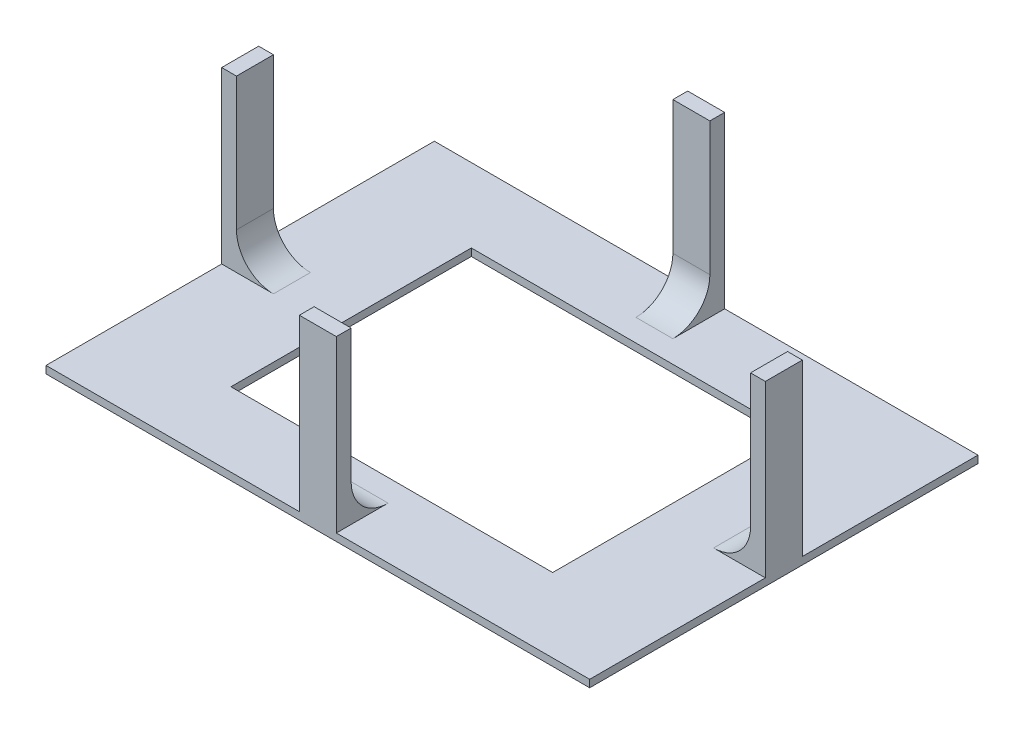
ISO-10303-21;
HEADER;
FILE_DESCRIPTION(('STEP AP214'),'2;1');
FILE_NAME('part.step','',(''),(''),'','','');
FILE_SCHEMA(('AUTOMOTIVE_DESIGN { 1 0 10303 214 1 1 1 1 }'));
ENDSEC;
DATA;
#1=APPLICATION_CONTEXT('core data for automotive mechanical design processes');
#2=APPLICATION_PROTOCOL_DEFINITION('international standard','automotive_design',2000,#1);
#3=PRODUCT_CONTEXT('',#1,'mechanical');
#4=PRODUCT('Part','Part','',(#3));
#5=PRODUCT_RELATED_PRODUCT_CATEGORY('part','',(#4));
#6=PRODUCT_DEFINITION_FORMATION('','',#4);
#7=PRODUCT_DEFINITION_CONTEXT('part definition',#1,'design');
#8=PRODUCT_DEFINITION('design','',#6,#7);
#9=PRODUCT_DEFINITION_SHAPE('','',#8);
#10=(LENGTH_UNIT() NAMED_UNIT(*) SI_UNIT(.MILLI.,.METRE.));
#11=(NAMED_UNIT(*) PLANE_ANGLE_UNIT() SI_UNIT($,.RADIAN.));
#12=(NAMED_UNIT(*) SI_UNIT($,.STERADIAN.) SOLID_ANGLE_UNIT());
#13=UNCERTAINTY_MEASURE_WITH_UNIT(LENGTH_MEASURE(1.E-05),#10,'distance_accuracy_value','');
#14=(GEOMETRIC_REPRESENTATION_CONTEXT(3) GLOBAL_UNCERTAINTY_ASSIGNED_CONTEXT((#13)) GLOBAL_UNIT_ASSIGNED_CONTEXT((#10,
#11,#12)) REPRESENTATION_CONTEXT('',''));
#15=CARTESIAN_POINT('',(0.,0.,0.));
#16=DIRECTION('',(0.,0.,1.));
#17=DIRECTION('',(1.,0.,0.));
#18=AXIS2_PLACEMENT_3D('',#15,#16,#17);
#19=CARTESIAN_POINT('',(29.75,6.,0.));
#20=DIRECTION('',(0.,0.,1.));
#21=DIRECTION('',(1.,0.,0.));
#22=AXIS2_PLACEMENT_3D('',#19,#20,#21);
#23=CYLINDRICAL_SURFACE('',#22,5.);
#24=DIRECTION('',(0.,0.,1.));
#25=VECTOR('',#24,1.);
#26=CARTESIAN_POINT('',(34.75,6.,0.));
#27=LINE('',#26,#25);
#28=CARTESIAN_POINT('',(34.75,6.,-2.49999999999999));
#29=VERTEX_POINT('',#28);
#30=CARTESIAN_POINT('',(34.75,6.,2.49999999999999));
#31=VERTEX_POINT('',#30);
#32=EDGE_CURVE('E261',#29,#31,#27,.T.);
#33=ORIENTED_EDGE('',*,*,#32,.F.);
#34=CARTESIAN_POINT('',(29.75,6.,-2.49999999999999));
#35=DIRECTION('',(0.,0.,1.));
#36=DIRECTION('',(1.,0.,0.));
#37=AXIS2_PLACEMENT_3D('',#34,#35,#36);
#38=CIRCLE('',#37,5.);
#39=CARTESIAN_POINT('',(29.75,1.,-2.49999999999999));
#40=VERTEX_POINT('',#39);
#41=EDGE_CURVE('E253',#29,#40,#38,.F.);
#42=ORIENTED_EDGE('',*,*,#41,.T.);
#43=DIRECTION('',(0.,0.,1.));
#44=VECTOR('',#43,1.);
#45=CARTESIAN_POINT('',(29.75,1.,0.));
#46=LINE('',#45,#44);
#47=CARTESIAN_POINT('',(29.75,1.,2.49999999999999));
#48=VERTEX_POINT('',#47);
#49=EDGE_CURVE('E257',#48,#40,#46,.F.);
#50=ORIENTED_EDGE('',*,*,#49,.F.);
#51=CARTESIAN_POINT('',(29.75,6.,2.49999999999999));
#52=DIRECTION('',(0.,0.,-1.));
#53=DIRECTION('',(-1.,0.,0.));
#54=AXIS2_PLACEMENT_3D('',#51,#52,#53);
#55=CIRCLE('',#54,5.);
#56=EDGE_CURVE('E232',#48,#31,#55,.F.);
#57=ORIENTED_EDGE('',*,*,#56,.T.);
#58=EDGE_LOOP('',(#33,#42,#50,#57));
#59=FACE_BOUND('',#58,.T.);
#60=ADVANCED_FACE('F44',(#59),#23,.F.);
#61=CARTESIAN_POINT('',(0.,6.,19.25));
#62=DIRECTION('',(1.,0.,0.));
#63=DIRECTION('',(0.,0.,-1.));
#64=AXIS2_PLACEMENT_3D('',#61,#62,#63);
#65=CYLINDRICAL_SURFACE('',#64,5.);
#66=DIRECTION('',(1.,0.,0.));
#67=VECTOR('',#66,1.);
#68=CARTESIAN_POINT('',(0.,1.,19.25));
#69=LINE('',#68,#67);
#70=CARTESIAN_POINT('',(-2.5,1.,19.25));
#71=VERTEX_POINT('',#70);
#72=CARTESIAN_POINT('',(2.5,1.,19.25));
#73=VERTEX_POINT('',#72);
#74=EDGE_CURVE('E276',#71,#73,#69,.T.);
#75=ORIENTED_EDGE('',*,*,#74,.F.);
#76=CARTESIAN_POINT('',(-2.5,6.,19.25));
#77=DIRECTION('',(1.,0.,0.));
#78=DIRECTION('',(0.,0.,-1.));
#79=AXIS2_PLACEMENT_3D('',#76,#77,#78);
#80=CIRCLE('',#79,5.);
#81=CARTESIAN_POINT('',(-2.5,6.,24.25));
#82=VERTEX_POINT('',#81);
#83=EDGE_CURVE('E269',#71,#82,#80,.F.);
#84=ORIENTED_EDGE('',*,*,#83,.T.);
#85=DIRECTION('',(1.,0.,0.));
#86=VECTOR('',#85,1.);
#87=CARTESIAN_POINT('',(0.,6.,24.25));
#88=LINE('',#87,#86);
#89=CARTESIAN_POINT('',(2.5,6.,24.25));
#90=VERTEX_POINT('',#89);
#91=EDGE_CURVE('E272',#90,#82,#88,.F.);
#92=ORIENTED_EDGE('',*,*,#91,.F.);
#93=CARTESIAN_POINT('',(2.5,6.,19.25));
#94=DIRECTION('',(-1.,0.,0.));
#95=DIRECTION('',(0.,0.,1.));
#96=AXIS2_PLACEMENT_3D('',#93,#94,#95);
#97=CIRCLE('',#96,5.);
#98=EDGE_CURVE('E265',#90,#73,#97,.F.);
#99=ORIENTED_EDGE('',*,*,#98,.T.);
#100=EDGE_LOOP('',(#75,#84,#92,#99));
#101=FACE_BOUND('',#100,.T.);
#102=ADVANCED_FACE('F638',(#101),#65,.F.);
#103=CARTESIAN_POINT('',(-29.75,6.,0.));
#104=DIRECTION('',(0.,0.,-1.));
#105=DIRECTION('',(-1.,0.,0.));
#106=AXIS2_PLACEMENT_3D('',#103,#104,#105);
#107=CYLINDRICAL_SURFACE('',#106,5.);
#108=DIRECTION('',(0.,0.,-1.));
#109=VECTOR('',#108,1.);
#110=CARTESIAN_POINT('',(-34.75,6.,0.));
#111=LINE('',#110,#109);
#112=CARTESIAN_POINT('',(-34.75,6.,2.49999999999999));
#113=VERTEX_POINT('',#112);
#114=CARTESIAN_POINT('',(-34.75,6.,-2.49999999999999));
#115=VERTEX_POINT('',#114);
#116=EDGE_CURVE('E291',#113,#115,#111,.T.);
#117=ORIENTED_EDGE('',*,*,#116,.F.);
#118=CARTESIAN_POINT('',(-29.75,6.,2.49999999999999));
#119=DIRECTION('',(0.,0.,-1.));
#120=DIRECTION('',(-1.,0.,0.));
#121=AXIS2_PLACEMENT_3D('',#118,#119,#120);
#122=CIRCLE('',#121,5.);
#123=CARTESIAN_POINT('',(-29.75,1.,2.49999999999999));
#124=VERTEX_POINT('',#123);
#125=EDGE_CURVE('E283',#113,#124,#122,.F.);
#126=ORIENTED_EDGE('',*,*,#125,.T.);
#127=DIRECTION('',(0.,0.,-1.));
#128=VECTOR('',#127,1.);
#129=CARTESIAN_POINT('',(-29.75,1.,0.));
#130=LINE('',#129,#128);
#131=CARTESIAN_POINT('',(-29.75,1.,-2.49999999999999));
#132=VERTEX_POINT('',#131);
#133=EDGE_CURVE('E287',#132,#124,#130,.F.);
#134=ORIENTED_EDGE('',*,*,#133,.F.);
#135=CARTESIAN_POINT('',(-29.75,6.,-2.49999999999999));
#136=DIRECTION('',(0.,0.,1.));
#137=DIRECTION('',(1.,0.,0.));
#138=AXIS2_PLACEMENT_3D('',#135,#136,#137);
#139=CIRCLE('',#138,5.);
#140=EDGE_CURVE('E280',#132,#115,#139,.F.);
#141=ORIENTED_EDGE('',*,*,#140,.T.);
#142=EDGE_LOOP('',(#117,#126,#134,#141));
#143=FACE_BOUND('',#142,.T.);
#144=ADVANCED_FACE('F644',(#143),#107,.F.);
#145=CARTESIAN_POINT('',(0.,6.,-19.25));
#146=DIRECTION('',(-1.,0.,0.));
#147=DIRECTION('',(0.,0.,1.));
#148=AXIS2_PLACEMENT_3D('',#145,#146,#147);
#149=CYLINDRICAL_SURFACE('',#148,5.);
#150=DIRECTION('',(-1.,0.,0.));
#151=VECTOR('',#150,1.);
#152=CARTESIAN_POINT('',(0.,1.,-19.25));
#153=LINE('',#152,#151);
#154=CARTESIAN_POINT('',(2.5,1.,-19.25));
#155=VERTEX_POINT('',#154);
#156=CARTESIAN_POINT('',(-2.5,1.,-19.25));
#157=VERTEX_POINT('',#156);
#158=EDGE_CURVE('E306',#155,#157,#153,.T.);
#159=ORIENTED_EDGE('',*,*,#158,.F.);
#160=CARTESIAN_POINT('',(2.5,6.,-19.25));
#161=DIRECTION('',(-1.,0.,0.));
#162=DIRECTION('',(0.,0.,1.));
#163=AXIS2_PLACEMENT_3D('',#160,#161,#162);
#164=CIRCLE('',#163,5.);
#165=CARTESIAN_POINT('',(2.5,6.,-24.25));
#166=VERTEX_POINT('',#165);
#167=EDGE_CURVE('E299',#155,#166,#164,.F.);
#168=ORIENTED_EDGE('',*,*,#167,.T.);
#169=DIRECTION('',(-1.,0.,0.));
#170=VECTOR('',#169,1.);
#171=CARTESIAN_POINT('',(0.,6.,-24.25));
#172=LINE('',#171,#170);
#173=CARTESIAN_POINT('',(-2.5,6.,-24.25));
#174=VERTEX_POINT('',#173);
#175=EDGE_CURVE('E302',#174,#166,#172,.F.);
#176=ORIENTED_EDGE('',*,*,#175,.F.);
#177=CARTESIAN_POINT('',(-2.5,6.,-19.25));
#178=DIRECTION('',(1.,0.,0.));
#179=DIRECTION('',(0.,0.,-1.));
#180=AXIS2_PLACEMENT_3D('',#177,#178,#179);
#181=CIRCLE('',#180,5.);
#182=EDGE_CURVE('E295',#174,#157,#181,.F.);
#183=ORIENTED_EDGE('',*,*,#182,.T.);
#184=EDGE_LOOP('',(#159,#168,#176,#183));
#185=FACE_BOUND('',#184,.T.);
#186=ADVANCED_FACE('F619',(#185),#149,.F.);
#187=CARTESIAN_POINT('',(0.,24.,0.));
#188=DIRECTION('',(0.,-1.,0.));
#189=DIRECTION('',(0.,0.,-1.));
#190=AXIS2_PLACEMENT_3D('',#187,#188,#189);
#191=PLANE('',#190);
#192=DIRECTION('',(0.,0.,-1.));
#193=VECTOR('',#192,1.);
#194=CARTESIAN_POINT('',(36.75,24.,26.25));
#195=LINE('',#194,#193);
#196=CARTESIAN_POINT('',(36.75,24.,2.49999999999999));
#197=VERTEX_POINT('',#196);
#198=CARTESIAN_POINT('',(36.75,24.,-2.49999999999999));
#199=VERTEX_POINT('',#198);
#200=EDGE_CURVE('E327',#197,#199,#195,.T.);
#201=ORIENTED_EDGE('',*,*,#200,.T.);
#202=DIRECTION('',(1.,0.,0.));
#203=VECTOR('',#202,1.);
#204=CARTESIAN_POINT('',(0.,24.,-2.49999999999999));
#205=LINE('',#204,#203);
#206=CARTESIAN_POINT('',(34.75,24.,-2.49999999999999));
#207=VERTEX_POINT('',#206);
#208=EDGE_CURVE('E459',#207,#199,#205,.T.);
#209=ORIENTED_EDGE('',*,*,#208,.F.);
#210=DIRECTION('',(0.,0.,-1.));
#211=VECTOR('',#210,1.);
#212=CARTESIAN_POINT('',(34.75,24.,0.));
#213=LINE('',#212,#211);
#214=CARTESIAN_POINT('',(34.75,24.,2.49999999999999));
#215=VERTEX_POINT('',#214);
#216=EDGE_CURVE('E362',#215,#207,#213,.T.);
#217=ORIENTED_EDGE('',*,*,#216,.F.);
#218=DIRECTION('',(-1.,0.,0.));
#219=VECTOR('',#218,1.);
#220=CARTESIAN_POINT('',(0.,24.,2.49999999999999));
#221=LINE('',#220,#219);
#222=EDGE_CURVE('E452',#197,#215,#221,.T.);
#223=ORIENTED_EDGE('',*,*,#222,.F.);
#224=EDGE_LOOP('',(#201,#209,#217,#223));
#225=FACE_BOUND('',#224,.T.);
#226=ADVANCED_FACE('F575',(#225),#191,.F.);
#227=DIRECTION('',(0.,0.,1.));
#228=VECTOR('',#227,1.);
#229=CARTESIAN_POINT('',(-36.75,24.,26.25));
#230=LINE('',#229,#228);
#231=CARTESIAN_POINT('',(-36.75,24.,-2.49999999999999));
#232=VERTEX_POINT('',#231);
#233=CARTESIAN_POINT('',(-36.75,24.,2.49999999999999));
#234=VERTEX_POINT('',#233);
#235=EDGE_CURVE('E344',#232,#234,#230,.T.);
#236=ORIENTED_EDGE('',*,*,#235,.T.);
#237=DIRECTION('',(-1.,0.,0.));
#238=VECTOR('',#237,1.);
#239=CARTESIAN_POINT('',(0.,24.,2.49999999999999));
#240=LINE('',#239,#238);
#241=CARTESIAN_POINT('',(-34.75,24.,2.49999999999999));
#242=VERTEX_POINT('',#241);
#243=EDGE_CURVE('E430',#242,#234,#240,.T.);
#244=ORIENTED_EDGE('',*,*,#243,.F.);
#245=DIRECTION('',(0.,0.,1.));
#246=VECTOR('',#245,1.);
#247=CARTESIAN_POINT('',(-34.75,24.,0.));
#248=LINE('',#247,#246);
#249=CARTESIAN_POINT('',(-34.75,24.,-2.49999999999999));
#250=VERTEX_POINT('',#249);
#251=EDGE_CURVE('E340',#250,#242,#248,.T.);
#252=ORIENTED_EDGE('',*,*,#251,.F.);
#253=DIRECTION('',(1.,0.,0.));
#254=VECTOR('',#253,1.);
#255=CARTESIAN_POINT('',(0.,24.,-2.49999999999999));
#256=LINE('',#255,#254);
#257=EDGE_CURVE('E410',#232,#250,#256,.T.);
#258=ORIENTED_EDGE('',*,*,#257,.F.);
#259=EDGE_LOOP('',(#236,#244,#252,#258));
#260=FACE_BOUND('',#259,.T.);
#261=ADVANCED_FACE('F600',(#260),#191,.F.);
#262=DIRECTION('',(1.,0.,0.));
#263=VECTOR('',#262,1.);
#264=CARTESIAN_POINT('',(0.,24.,24.25));
#265=LINE('',#264,#263);
#266=CARTESIAN_POINT('',(-2.5,24.,24.25));
#267=VERTEX_POINT('',#266);
#268=CARTESIAN_POINT('',(2.5,24.,24.25));
#269=VERTEX_POINT('',#268);
#270=EDGE_CURVE('E366',#267,#269,#265,.T.);
#271=ORIENTED_EDGE('',*,*,#270,.F.);
#272=DIRECTION('',(0.,0.,-1.));
#273=VECTOR('',#272,1.);
#274=CARTESIAN_POINT('',(-2.5,24.,0.));
#275=LINE('',#274,#273);
#276=CARTESIAN_POINT('',(-2.5,24.,26.25));
#277=VERTEX_POINT('',#276);
#278=EDGE_CURVE('E441',#277,#267,#275,.T.);
#279=ORIENTED_EDGE('',*,*,#278,.F.);
#280=DIRECTION('',(1.,0.,0.));
#281=VECTOR('',#280,1.);
#282=CARTESIAN_POINT('',(-36.75,24.,26.25));
#283=LINE('',#282,#281);
#284=CARTESIAN_POINT('',(2.5,24.,26.25));
#285=VERTEX_POINT('',#284);
#286=EDGE_CURVE('E322',#277,#285,#283,.T.);
#287=ORIENTED_EDGE('',*,*,#286,.T.);
#288=DIRECTION('',(0.,0.,1.));
#289=VECTOR('',#288,1.);
#290=CARTESIAN_POINT('',(2.5,24.,0.));
#291=LINE('',#290,#289);
#292=EDGE_CURVE('E483',#269,#285,#291,.T.);
#293=ORIENTED_EDGE('',*,*,#292,.F.);
#294=EDGE_LOOP('',(#271,#279,#287,#293));
#295=FACE_BOUND('',#294,.T.);
#296=ADVANCED_FACE('F588',(#295),#191,.F.);
#297=CARTESIAN_POINT('',(36.75,24.,26.25));
#298=DIRECTION('',(-1.,0.,0.));
#299=DIRECTION('',(0.,0.,1.));
#300=AXIS2_PLACEMENT_3D('',#297,#298,#299);
#301=PLANE('',#300);
#302=DIRECTION('',(0.,0.,-1.));
#303=VECTOR('',#302,1.);
#304=CARTESIAN_POINT('',(36.75,1.,0.));
#305=LINE('',#304,#303);
#306=CARTESIAN_POINT('',(36.75,1.,-2.49999999999999));
#307=VERTEX_POINT('',#306);
#308=CARTESIAN_POINT('',(36.75,1.,-26.25));
#309=VERTEX_POINT('',#308);
#310=EDGE_CURVE('E466',#307,#309,#305,.T.);
#311=ORIENTED_EDGE('',*,*,#310,.F.);
#312=DIRECTION('',(0.,1.,0.));
#313=VECTOR('',#312,1.);
#314=CARTESIAN_POINT('',(36.75,1.,-2.49999999999999));
#315=LINE('',#314,#313);
#316=EDGE_CURVE('E445',#307,#199,#315,.T.);
#317=ORIENTED_EDGE('',*,*,#316,.T.);
#318=ORIENTED_EDGE('',*,*,#200,.F.);
#319=DIRECTION('',(0.,1.,0.));
#320=VECTOR('',#319,1.);
#321=CARTESIAN_POINT('',(36.75,1.,2.49999999999999));
#322=LINE('',#321,#320);
#323=CARTESIAN_POINT('',(36.75,1.,2.49999999999999));
#324=VERTEX_POINT('',#323);
#325=EDGE_CURVE('E494',#324,#197,#322,.T.);
#326=ORIENTED_EDGE('',*,*,#325,.F.);
#327=DIRECTION('',(0.,0.,-1.));
#328=VECTOR('',#327,1.);
#329=CARTESIAN_POINT('',(36.75,1.,0.));
#330=LINE('',#329,#328);
#331=CARTESIAN_POINT('',(36.75,1.,26.25));
#332=VERTEX_POINT('',#331);
#333=EDGE_CURVE('E484',#332,#324,#330,.T.);
#334=ORIENTED_EDGE('',*,*,#333,.F.);
#335=DIRECTION('',(0.,-1.,0.));
#336=VECTOR('',#335,1.);
#337=CARTESIAN_POINT('',(36.75,24.,26.25));
#338=LINE('',#337,#336);
#339=CARTESIAN_POINT('',(36.75,0.,26.25));
#340=VERTEX_POINT('',#339);
#341=EDGE_CURVE('E319',#332,#340,#338,.T.);
#342=ORIENTED_EDGE('',*,*,#341,.T.);
#343=DIRECTION('',(0.,0.,-1.));
#344=VECTOR('',#343,1.);
#345=CARTESIAN_POINT('',(36.75,0.,26.25));
#346=LINE('',#345,#344);
#347=CARTESIAN_POINT('',(36.75,0.,-26.25));
#348=VERTEX_POINT('',#347);
#349=EDGE_CURVE('E336',#340,#348,#346,.T.);
#350=ORIENTED_EDGE('',*,*,#349,.T.);
#351=DIRECTION('',(0.,-1.,0.));
#352=VECTOR('',#351,1.);
#353=CARTESIAN_POINT('',(36.75,24.,-26.25));
#354=LINE('',#353,#352);
#355=EDGE_CURVE('E310',#309,#348,#354,.T.);
#356=ORIENTED_EDGE('',*,*,#355,.F.);
#357=EDGE_LOOP('',(#311,#317,#318,#326,#334,#342,#350,#356));
#358=FACE_BOUND('',#357,.T.);
#359=ADVANCED_FACE('F545',(#358),#301,.F.);
#360=CARTESIAN_POINT('',(-36.75,24.,-26.25));
#361=DIRECTION('',(0.,0.,1.));
#362=DIRECTION('',(1.,0.,0.));
#363=AXIS2_PLACEMENT_3D('',#360,#361,#362);
#364=PLANE('',#363);
#365=DIRECTION('',(-1.,0.,0.));
#366=VECTOR('',#365,1.);
#367=CARTESIAN_POINT('',(-36.75,24.,-26.25));
#368=LINE('',#367,#366);
#369=CARTESIAN_POINT('',(2.5,24.,-26.25));
#370=VERTEX_POINT('',#369);
#371=CARTESIAN_POINT('',(-2.5,24.,-26.25));
#372=VERTEX_POINT('',#371);
#373=EDGE_CURVE('E348',#370,#372,#368,.T.);
#374=ORIENTED_EDGE('',*,*,#373,.F.);
#375=DIRECTION('',(0.,1.,0.));
#376=VECTOR('',#375,1.);
#377=CARTESIAN_POINT('',(2.5,1.,-26.25));
#378=LINE('',#377,#376);
#379=CARTESIAN_POINT('',(2.5,1.,-26.25));
#380=VERTEX_POINT('',#379);
#381=EDGE_CURVE('E469',#380,#370,#378,.T.);
#382=ORIENTED_EDGE('',*,*,#381,.F.);
#383=DIRECTION('',(-1.,0.,0.));
#384=VECTOR('',#383,1.);
#385=CARTESIAN_POINT('',(0.,1.,-26.25));
#386=LINE('',#385,#384);
#387=EDGE_CURVE('E455',#309,#380,#386,.T.);
#388=ORIENTED_EDGE('',*,*,#387,.F.);
#389=ORIENTED_EDGE('',*,*,#355,.T.);
#390=DIRECTION('',(-1.,0.,0.));
#391=VECTOR('',#390,1.);
#392=CARTESIAN_POINT('',(-36.75,0.,-26.25));
#393=LINE('',#392,#391);
#394=CARTESIAN_POINT('',(-36.75,0.,-26.25));
#395=VERTEX_POINT('',#394);
#396=EDGE_CURVE('E332',#348,#395,#393,.T.);
#397=ORIENTED_EDGE('',*,*,#396,.T.);
#398=DIRECTION('',(0.,-1.,0.));
#399=VECTOR('',#398,1.);
#400=CARTESIAN_POINT('',(-36.75,24.,-26.25));
#401=LINE('',#400,#399);
#402=CARTESIAN_POINT('',(-36.75,1.,-26.25));
#403=VERTEX_POINT('',#402);
#404=EDGE_CURVE('E313',#403,#395,#401,.T.);
#405=ORIENTED_EDGE('',*,*,#404,.F.);
#406=DIRECTION('',(-1.,0.,0.));
#407=VECTOR('',#406,1.);
#408=CARTESIAN_POINT('',(0.,1.,-26.25));
#409=LINE('',#408,#407);
#410=CARTESIAN_POINT('',(-2.5,1.,-26.25));
#411=VERTEX_POINT('',#410);
#412=EDGE_CURVE('E409',#411,#403,#409,.T.);
#413=ORIENTED_EDGE('',*,*,#412,.F.);
#414=DIRECTION('',(0.,1.,0.));
#415=VECTOR('',#414,1.);
#416=CARTESIAN_POINT('',(-2.5,1.,-26.25));
#417=LINE('',#416,#415);
#418=EDGE_CURVE('E398',#411,#372,#417,.T.);
#419=ORIENTED_EDGE('',*,*,#418,.T.);
#420=EDGE_LOOP('',(#374,#382,#388,#389,#397,#405,#413,#419));
#421=FACE_BOUND('',#420,.T.);
#422=ADVANCED_FACE('F565',(#421),#364,.F.);
#423=CARTESIAN_POINT('',(-36.75,24.,26.25));
#424=DIRECTION('',(1.,0.,0.));
#425=DIRECTION('',(0.,0.,-1.));
#426=AXIS2_PLACEMENT_3D('',#423,#424,#425);
#427=PLANE('',#426);
#428=DIRECTION('',(0.,0.,1.));
#429=VECTOR('',#428,1.);
#430=CARTESIAN_POINT('',(-36.75,1.,0.));
#431=LINE('',#430,#429);
#432=CARTESIAN_POINT('',(-36.75,1.,2.49999999999999));
#433=VERTEX_POINT('',#432);
#434=CARTESIAN_POINT('',(-36.75,1.,26.25));
#435=VERTEX_POINT('',#434);
#436=EDGE_CURVE('E437',#433,#435,#431,.T.);
#437=ORIENTED_EDGE('',*,*,#436,.F.);
#438=DIRECTION('',(0.,1.,0.));
#439=VECTOR('',#438,1.);
#440=CARTESIAN_POINT('',(-36.75,1.,2.49999999999999));
#441=LINE('',#440,#439);
#442=EDGE_CURVE('E448',#433,#234,#441,.T.);
#443=ORIENTED_EDGE('',*,*,#442,.T.);
#444=ORIENTED_EDGE('',*,*,#235,.F.);
#445=DIRECTION('',(0.,1.,0.));
#446=VECTOR('',#445,1.);
#447=CARTESIAN_POINT('',(-36.75,1.,-2.49999999999999));
#448=LINE('',#447,#446);
#449=CARTESIAN_POINT('',(-36.75,1.,-2.49999999999999));
#450=VERTEX_POINT('',#449);
#451=EDGE_CURVE('E399',#450,#232,#448,.T.);
#452=ORIENTED_EDGE('',*,*,#451,.F.);
#453=DIRECTION('',(0.,0.,1.));
#454=VECTOR('',#453,1.);
#455=CARTESIAN_POINT('',(-36.75,1.,0.));
#456=LINE('',#455,#454);
#457=EDGE_CURVE('E420',#403,#450,#456,.T.);
#458=ORIENTED_EDGE('',*,*,#457,.F.);
#459=ORIENTED_EDGE('',*,*,#404,.T.);
#460=DIRECTION('',(0.,0.,1.));
#461=VECTOR('',#460,1.);
#462=CARTESIAN_POINT('',(-36.75,0.,26.25));
#463=LINE('',#462,#461);
#464=CARTESIAN_POINT('',(-36.75,0.,26.25));
#465=VERTEX_POINT('',#464);
#466=EDGE_CURVE('E328',#395,#465,#463,.T.);
#467=ORIENTED_EDGE('',*,*,#466,.T.);
#468=DIRECTION('',(0.,-1.,0.));
#469=VECTOR('',#468,1.);
#470=CARTESIAN_POINT('',(-36.75,24.,26.25));
#471=LINE('',#470,#469);
#472=EDGE_CURVE('E316',#435,#465,#471,.T.);
#473=ORIENTED_EDGE('',*,*,#472,.F.);
#474=EDGE_LOOP('',(#437,#443,#444,#452,#458,#459,#467,#473));
#475=FACE_BOUND('',#474,.T.);
#476=ADVANCED_FACE('F558',(#475),#427,.F.);
#477=CARTESIAN_POINT('',(-36.75,24.,26.25));
#478=DIRECTION('',(0.,0.,-1.));
#479=DIRECTION('',(-1.,0.,0.));
#480=AXIS2_PLACEMENT_3D('',#477,#478,#479);
#481=PLANE('',#480);
#482=ORIENTED_EDGE('',*,*,#286,.F.);
#483=DIRECTION('',(0.,1.,0.));
#484=VECTOR('',#483,1.);
#485=CARTESIAN_POINT('',(-2.5,1.,26.25));
#486=LINE('',#485,#484);
#487=CARTESIAN_POINT('',(-2.5,1.,26.25));
#488=VERTEX_POINT('',#487);
#489=EDGE_CURVE('E440',#488,#277,#486,.T.);
#490=ORIENTED_EDGE('',*,*,#489,.F.);
#491=DIRECTION('',(1.,0.,0.));
#492=VECTOR('',#491,1.);
#493=CARTESIAN_POINT('',(0.,1.,26.25));
#494=LINE('',#493,#492);
#495=EDGE_CURVE('E426',#435,#488,#494,.T.);
#496=ORIENTED_EDGE('',*,*,#495,.F.);
#497=ORIENTED_EDGE('',*,*,#472,.T.);
#498=DIRECTION('',(1.,0.,0.));
#499=VECTOR('',#498,1.);
#500=CARTESIAN_POINT('',(-36.75,0.,26.25));
#501=LINE('',#500,#499);
#502=EDGE_CURVE('E323',#465,#340,#501,.T.);
#503=ORIENTED_EDGE('',*,*,#502,.T.);
#504=ORIENTED_EDGE('',*,*,#341,.F.);
#505=DIRECTION('',(1.,0.,0.));
#506=VECTOR('',#505,1.);
#507=CARTESIAN_POINT('',(0.,1.,26.25));
#508=LINE('',#507,#506);
#509=CARTESIAN_POINT('',(2.5,1.,26.25));
#510=VERTEX_POINT('',#509);
#511=EDGE_CURVE('E480',#510,#332,#508,.T.);
#512=ORIENTED_EDGE('',*,*,#511,.F.);
#513=DIRECTION('',(0.,1.,0.));
#514=VECTOR('',#513,1.);
#515=CARTESIAN_POINT('',(2.5,1.,26.25));
#516=LINE('',#515,#514);
#517=EDGE_CURVE('E500',#510,#285,#516,.T.);
#518=ORIENTED_EDGE('',*,*,#517,.T.);
#519=EDGE_LOOP('',(#482,#490,#496,#497,#503,#504,#512,#518));
#520=FACE_BOUND('',#519,.T.);
#521=ADVANCED_FACE('F552',(#520),#481,.F.);
#522=DIRECTION('',(-1.,0.,0.));
#523=VECTOR('',#522,1.);
#524=CARTESIAN_POINT('',(0.,24.,-24.25));
#525=LINE('',#524,#523);
#526=CARTESIAN_POINT('',(2.5,24.,-24.25));
#527=VERTEX_POINT('',#526);
#528=CARTESIAN_POINT('',(-2.5,24.,-24.25));
#529=VERTEX_POINT('',#528);
#530=EDGE_CURVE('E358',#527,#529,#525,.T.);
#531=ORIENTED_EDGE('',*,*,#530,.F.);
#532=DIRECTION('',(0.,0.,1.));
#533=VECTOR('',#532,1.);
#534=CARTESIAN_POINT('',(2.5,24.,0.));
#535=LINE('',#534,#533);
#536=EDGE_CURVE('E414',#370,#527,#535,.T.);
#537=ORIENTED_EDGE('',*,*,#536,.F.);
#538=ORIENTED_EDGE('',*,*,#373,.T.);
#539=DIRECTION('',(0.,0.,-1.));
#540=VECTOR('',#539,1.);
#541=CARTESIAN_POINT('',(-2.5,24.,0.));
#542=LINE('',#541,#540);
#543=EDGE_CURVE('E406',#529,#372,#542,.T.);
#544=ORIENTED_EDGE('',*,*,#543,.F.);
#545=EDGE_LOOP('',(#531,#537,#538,#544));
#546=FACE_BOUND('',#545,.T.);
#547=ADVANCED_FACE('F536',(#546),#191,.F.);
#548=CARTESIAN_POINT('',(0.,0.,0.));
#549=DIRECTION('',(0.,-1.,0.));
#550=DIRECTION('',(0.,0.,-1.));
#551=AXIS2_PLACEMENT_3D('',#548,#549,#550);
#552=PLANE('',#551);
#553=DIRECTION('',(0.,0.,1.));
#554=VECTOR('',#553,1.);
#555=CARTESIAN_POINT('',(21.75,0.,0.));
#556=LINE('',#555,#554);
#557=CARTESIAN_POINT('',(21.75,0.,-16.25));
#558=VERTEX_POINT('',#557);
#559=CARTESIAN_POINT('',(21.75,0.,16.25));
#560=VERTEX_POINT('',#559);
#561=EDGE_CURVE('E504',#558,#560,#556,.T.);
#562=ORIENTED_EDGE('',*,*,#561,.F.);
#563=DIRECTION('',(1.,0.,0.));
#564=VECTOR('',#563,1.);
#565=CARTESIAN_POINT('',(0.,0.,-16.25));
#566=LINE('',#565,#564);
#567=CARTESIAN_POINT('',(-21.75,0.,-16.25));
#568=VERTEX_POINT('',#567);
#569=EDGE_CURVE('E514',#568,#558,#566,.T.);
#570=ORIENTED_EDGE('',*,*,#569,.F.);
#571=DIRECTION('',(0.,0.,-1.));
#572=VECTOR('',#571,1.);
#573=CARTESIAN_POINT('',(-21.75,0.,0.));
#574=LINE('',#573,#572);
#575=CARTESIAN_POINT('',(-21.75,0.,16.25));
#576=VERTEX_POINT('',#575);
#577=EDGE_CURVE('E239',#576,#568,#574,.T.);
#578=ORIENTED_EDGE('',*,*,#577,.F.);
#579=DIRECTION('',(-1.,0.,0.));
#580=VECTOR('',#579,1.);
#581=CARTESIAN_POINT('',(0.,0.,16.25));
#582=LINE('',#581,#580);
#583=EDGE_CURVE('E509',#560,#576,#582,.T.);
#584=ORIENTED_EDGE('',*,*,#583,.F.);
#585=EDGE_LOOP('',(#562,#570,#578,#584));
#586=FACE_BOUND('',#585,.T.);
#587=ORIENTED_EDGE('',*,*,#349,.F.);
#588=ORIENTED_EDGE('',*,*,#502,.F.);
#589=ORIENTED_EDGE('',*,*,#466,.F.);
#590=ORIENTED_EDGE('',*,*,#396,.F.);
#591=EDGE_LOOP('',(#587,#588,#589,#590));
#592=FACE_BOUND('',#591,.T.);
#593=ADVANCED_FACE('F532',(#586,#592),#552,.T.);
#594=CARTESIAN_POINT('',(0.,1.,24.25));
#595=DIRECTION('',(0.,0.,1.));
#596=DIRECTION('',(1.,0.,0.));
#597=AXIS2_PLACEMENT_3D('',#594,#595,#596);
#598=PLANE('',#597);
#599=DIRECTION('',(0.,-1.,0.));
#600=VECTOR('',#599,1.);
#601=CARTESIAN_POINT('',(2.5,1.,24.25));
#602=LINE('',#601,#600);
#603=EDGE_CURVE('E384',#269,#90,#602,.T.);
#604=ORIENTED_EDGE('',*,*,#603,.T.);
#605=ORIENTED_EDGE('',*,*,#91,.T.);
#606=DIRECTION('',(0.,1.,0.));
#607=VECTOR('',#606,1.);
#608=CARTESIAN_POINT('',(-2.5,1.,24.25));
#609=LINE('',#608,#607);
#610=EDGE_CURVE('E381',#82,#267,#609,.T.);
#611=ORIENTED_EDGE('',*,*,#610,.T.);
#612=ORIENTED_EDGE('',*,*,#270,.T.);
#613=EDGE_LOOP('',(#604,#605,#611,#612));
#614=FACE_BOUND('',#613,.T.);
#615=ADVANCED_FACE('F535',(#614),#598,.F.);
#616=CARTESIAN_POINT('',(-34.75,1.,0.));
#617=DIRECTION('',(-1.,0.,0.));
#618=DIRECTION('',(0.,0.,1.));
#619=AXIS2_PLACEMENT_3D('',#616,#617,#618);
#620=PLANE('',#619);
#621=DIRECTION('',(0.,-1.,0.));
#622=VECTOR('',#621,1.);
#623=CARTESIAN_POINT('',(-34.75,1.,2.49999999999999));
#624=LINE('',#623,#622);
#625=EDGE_CURVE('E377',#242,#113,#624,.T.);
#626=ORIENTED_EDGE('',*,*,#625,.T.);
#627=ORIENTED_EDGE('',*,*,#116,.T.);
#628=DIRECTION('',(0.,1.,0.));
#629=VECTOR('',#628,1.);
#630=CARTESIAN_POINT('',(-34.75,1.,-2.49999999999999));
#631=LINE('',#630,#629);
#632=EDGE_CURVE('E395',#115,#250,#631,.T.);
#633=ORIENTED_EDGE('',*,*,#632,.T.);
#634=ORIENTED_EDGE('',*,*,#251,.T.);
#635=EDGE_LOOP('',(#626,#627,#633,#634));
#636=FACE_BOUND('',#635,.T.);
#637=ADVANCED_FACE('F625',(#636),#620,.F.);
#638=CARTESIAN_POINT('',(0.,1.,-24.25));
#639=DIRECTION('',(0.,0.,-1.));
#640=DIRECTION('',(-1.,0.,0.));
#641=AXIS2_PLACEMENT_3D('',#638,#639,#640);
#642=PLANE('',#641);
#643=DIRECTION('',(0.,-1.,0.));
#644=VECTOR('',#643,1.);
#645=CARTESIAN_POINT('',(-2.5,1.,-24.25));
#646=LINE('',#645,#644);
#647=EDGE_CURVE('E391',#529,#174,#646,.T.);
#648=ORIENTED_EDGE('',*,*,#647,.T.);
#649=ORIENTED_EDGE('',*,*,#175,.T.);
#650=DIRECTION('',(0.,1.,0.));
#651=VECTOR('',#650,1.);
#652=CARTESIAN_POINT('',(2.5,1.,-24.25));
#653=LINE('',#652,#651);
#654=EDGE_CURVE('E374',#166,#527,#653,.T.);
#655=ORIENTED_EDGE('',*,*,#654,.T.);
#656=ORIENTED_EDGE('',*,*,#530,.T.);
#657=EDGE_LOOP('',(#648,#649,#655,#656));
#658=FACE_BOUND('',#657,.T.);
#659=ADVANCED_FACE('F622',(#658),#642,.F.);
#660=CARTESIAN_POINT('',(34.75,1.,0.));
#661=DIRECTION('',(1.,0.,0.));
#662=DIRECTION('',(0.,0.,-1.));
#663=AXIS2_PLACEMENT_3D('',#660,#661,#662);
#664=PLANE('',#663);
#665=DIRECTION('',(0.,-1.,0.));
#666=VECTOR('',#665,1.);
#667=CARTESIAN_POINT('',(34.75,1.,-2.49999999999999));
#668=LINE('',#667,#666);
#669=EDGE_CURVE('E370',#207,#29,#668,.T.);
#670=ORIENTED_EDGE('',*,*,#669,.T.);
#671=ORIENTED_EDGE('',*,*,#32,.T.);
#672=DIRECTION('',(0.,1.,0.));
#673=VECTOR('',#672,1.);
#674=CARTESIAN_POINT('',(34.75,1.,2.49999999999999));
#675=LINE('',#674,#673);
#676=EDGE_CURVE('E388',#31,#215,#675,.T.);
#677=ORIENTED_EDGE('',*,*,#676,.T.);
#678=ORIENTED_EDGE('',*,*,#216,.T.);
#679=EDGE_LOOP('',(#670,#671,#677,#678));
#680=FACE_BOUND('',#679,.T.);
#681=ADVANCED_FACE('F624',(#680),#664,.F.);
#682=CARTESIAN_POINT('',(0.,1.,0.));
#683=DIRECTION('',(0.,1.,0.));
#684=DIRECTION('',(0.,0.,1.));
#685=AXIS2_PLACEMENT_3D('',#682,#683,#684);
#686=PLANE('',#685);
#687=DIRECTION('',(0.,0.,-1.));
#688=VECTOR('',#687,1.);
#689=CARTESIAN_POINT('',(21.75,1.,0.));
#690=LINE('',#689,#688);
#691=CARTESIAN_POINT('',(21.75,1.,16.25));
#692=VERTEX_POINT('',#691);
#693=CARTESIAN_POINT('',(21.75,1.,-16.25));
#694=VERTEX_POINT('',#693);
#695=EDGE_CURVE('E11',#692,#694,#690,.T.);
#696=ORIENTED_EDGE('',*,*,#695,.F.);
#697=DIRECTION('',(1.,0.,0.));
#698=VECTOR('',#697,1.);
#699=CARTESIAN_POINT('',(0.,1.,16.25));
#700=LINE('',#699,#698);
#701=CARTESIAN_POINT('',(-21.75,1.,16.25));
#702=VERTEX_POINT('',#701);
#703=EDGE_CURVE('E52',#702,#692,#700,.T.);
#704=ORIENTED_EDGE('',*,*,#703,.F.);
#705=DIRECTION('',(0.,0.,1.));
#706=VECTOR('',#705,1.);
#707=CARTESIAN_POINT('',(-21.75,1.,0.));
#708=LINE('',#707,#706);
#709=CARTESIAN_POINT('',(-21.75,1.,-16.25));
#710=VERTEX_POINT('',#709);
#711=EDGE_CURVE('E231',#710,#702,#708,.T.);
#712=ORIENTED_EDGE('',*,*,#711,.F.);
#713=DIRECTION('',(-1.,0.,0.));
#714=VECTOR('',#713,1.);
#715=CARTESIAN_POINT('',(0.,1.,-16.25));
#716=LINE('',#715,#714);
#717=EDGE_CURVE('E225',#694,#710,#716,.T.);
#718=ORIENTED_EDGE('',*,*,#717,.F.);
#719=EDGE_LOOP('',(#696,#704,#712,#718));
#720=FACE_BOUND('',#719,.T.);
#721=ORIENTED_EDGE('',*,*,#49,.T.);
#722=DIRECTION('',(1.,0.,0.));
#723=VECTOR('',#722,1.);
#724=CARTESIAN_POINT('',(0.,1.,-2.49999999999999));
#725=LINE('',#724,#723);
#726=EDGE_CURVE('E463',#40,#307,#725,.T.);
#727=ORIENTED_EDGE('',*,*,#726,.T.);
#728=ORIENTED_EDGE('',*,*,#310,.T.);
#729=ORIENTED_EDGE('',*,*,#387,.T.);
#730=DIRECTION('',(0.,0.,1.));
#731=VECTOR('',#730,1.);
#732=CARTESIAN_POINT('',(2.5,1.,0.));
#733=LINE('',#732,#731);
#734=EDGE_CURVE('E460',#380,#155,#733,.T.);
#735=ORIENTED_EDGE('',*,*,#734,.T.);
#736=ORIENTED_EDGE('',*,*,#158,.T.);
#737=DIRECTION('',(0.,0.,-1.));
#738=VECTOR('',#737,1.);
#739=CARTESIAN_POINT('',(-2.5,1.,0.));
#740=LINE('',#739,#738);
#741=EDGE_CURVE('E402',#157,#411,#740,.T.);
#742=ORIENTED_EDGE('',*,*,#741,.T.);
#743=ORIENTED_EDGE('',*,*,#412,.T.);
#744=ORIENTED_EDGE('',*,*,#457,.T.);
#745=DIRECTION('',(1.,0.,0.));
#746=VECTOR('',#745,1.);
#747=CARTESIAN_POINT('',(0.,1.,-2.49999999999999));
#748=LINE('',#747,#746);
#749=EDGE_CURVE('E417',#450,#132,#748,.T.);
#750=ORIENTED_EDGE('',*,*,#749,.T.);
#751=ORIENTED_EDGE('',*,*,#133,.T.);
#752=DIRECTION('',(-1.,0.,0.));
#753=VECTOR('',#752,1.);
#754=CARTESIAN_POINT('',(0.,1.,2.49999999999999));
#755=LINE('',#754,#753);
#756=EDGE_CURVE('E434',#124,#433,#755,.T.);
#757=ORIENTED_EDGE('',*,*,#756,.T.);
#758=ORIENTED_EDGE('',*,*,#436,.T.);
#759=ORIENTED_EDGE('',*,*,#495,.T.);
#760=DIRECTION('',(0.,0.,-1.));
#761=VECTOR('',#760,1.);
#762=CARTESIAN_POINT('',(-2.5,1.,0.));
#763=LINE('',#762,#761);
#764=EDGE_CURVE('E431',#488,#71,#763,.T.);
#765=ORIENTED_EDGE('',*,*,#764,.T.);
#766=ORIENTED_EDGE('',*,*,#74,.T.);
#767=DIRECTION('',(0.,0.,1.));
#768=VECTOR('',#767,1.);
#769=CARTESIAN_POINT('',(2.5,1.,0.));
#770=LINE('',#769,#768);
#771=EDGE_CURVE('E491',#73,#510,#770,.T.);
#772=ORIENTED_EDGE('',*,*,#771,.T.);
#773=ORIENTED_EDGE('',*,*,#511,.T.);
#774=ORIENTED_EDGE('',*,*,#333,.T.);
#775=DIRECTION('',(-1.,0.,0.));
#776=VECTOR('',#775,1.);
#777=CARTESIAN_POINT('',(0.,1.,2.49999999999999));
#778=LINE('',#777,#776);
#779=EDGE_CURVE('E488',#324,#48,#778,.T.);
#780=ORIENTED_EDGE('',*,*,#779,.T.);
#781=EDGE_LOOP('',(#721,#727,#728,#729,#735,#736,#742,#743,#744,#750,#751,#757,#758,#759,#765,
#766,#772,#773,#774,#780));
#782=FACE_BOUND('',#781,.T.);
#783=ADVANCED_FACE('F245',(#720,#782),#686,.T.);
#784=CARTESIAN_POINT('',(2.5,1.,0.));
#785=DIRECTION('',(-1.,0.,0.));
#786=DIRECTION('',(0.,0.,1.));
#787=AXIS2_PLACEMENT_3D('',#784,#785,#786);
#788=PLANE('',#787);
#789=ORIENTED_EDGE('',*,*,#292,.T.);
#790=ORIENTED_EDGE('',*,*,#517,.F.);
#791=ORIENTED_EDGE('',*,*,#771,.F.);
#792=ORIENTED_EDGE('',*,*,#98,.F.);
#793=ORIENTED_EDGE('',*,*,#603,.F.);
#794=EDGE_LOOP('',(#789,#790,#791,#792,#793));
#795=FACE_BOUND('',#794,.T.);
#796=ADVANCED_FACE('F654',(#795),#788,.F.);
#797=CARTESIAN_POINT('',(0.,1.,2.49999999999999));
#798=DIRECTION('',(0.,0.,-1.));
#799=DIRECTION('',(-1.,0.,0.));
#800=AXIS2_PLACEMENT_3D('',#797,#798,#799);
#801=PLANE('',#800);
#802=ORIENTED_EDGE('',*,*,#779,.F.);
#803=ORIENTED_EDGE('',*,*,#325,.T.);
#804=ORIENTED_EDGE('',*,*,#222,.T.);
#805=ORIENTED_EDGE('',*,*,#676,.F.);
#806=ORIENTED_EDGE('',*,*,#56,.F.);
#807=EDGE_LOOP('',(#802,#803,#804,#805,#806));
#808=FACE_BOUND('',#807,.T.);
#809=ADVANCED_FACE('F579',(#808),#801,.F.);
#810=CARTESIAN_POINT('',(0.,1.,-2.49999999999999));
#811=DIRECTION('',(0.,0.,1.));
#812=DIRECTION('',(1.,0.,0.));
#813=AXIS2_PLACEMENT_3D('',#810,#811,#812);
#814=PLANE('',#813);
#815=ORIENTED_EDGE('',*,*,#208,.T.);
#816=ORIENTED_EDGE('',*,*,#316,.F.);
#817=ORIENTED_EDGE('',*,*,#726,.F.);
#818=ORIENTED_EDGE('',*,*,#41,.F.);
#819=ORIENTED_EDGE('',*,*,#669,.F.);
#820=EDGE_LOOP('',(#815,#816,#817,#818,#819));
#821=FACE_BOUND('',#820,.T.);
#822=ADVANCED_FACE('F647',(#821),#814,.F.);
#823=CARTESIAN_POINT('',(2.5,1.,0.));
#824=DIRECTION('',(-1.,0.,0.));
#825=DIRECTION('',(0.,0.,1.));
#826=AXIS2_PLACEMENT_3D('',#823,#824,#825);
#827=PLANE('',#826);
#828=ORIENTED_EDGE('',*,*,#734,.F.);
#829=ORIENTED_EDGE('',*,*,#381,.T.);
#830=ORIENTED_EDGE('',*,*,#536,.T.);
#831=ORIENTED_EDGE('',*,*,#654,.F.);
#832=ORIENTED_EDGE('',*,*,#167,.F.);
#833=EDGE_LOOP('',(#828,#829,#830,#831,#832));
#834=FACE_BOUND('',#833,.T.);
#835=ADVANCED_FACE('F615',(#834),#827,.F.);
#836=CARTESIAN_POINT('',(-2.5,1.,0.));
#837=DIRECTION('',(1.,0.,0.));
#838=DIRECTION('',(0.,0.,-1.));
#839=AXIS2_PLACEMENT_3D('',#836,#837,#838);
#840=PLANE('',#839);
#841=ORIENTED_EDGE('',*,*,#543,.T.);
#842=ORIENTED_EDGE('',*,*,#418,.F.);
#843=ORIENTED_EDGE('',*,*,#741,.F.);
#844=ORIENTED_EDGE('',*,*,#182,.F.);
#845=ORIENTED_EDGE('',*,*,#647,.F.);
#846=EDGE_LOOP('',(#841,#842,#843,#844,#845));
#847=FACE_BOUND('',#846,.T.);
#848=ADVANCED_FACE('F620',(#847),#840,.F.);
#849=CARTESIAN_POINT('',(0.,1.,-2.49999999999999));
#850=DIRECTION('',(0.,0.,1.));
#851=DIRECTION('',(1.,0.,0.));
#852=AXIS2_PLACEMENT_3D('',#849,#850,#851);
#853=PLANE('',#852);
#854=ORIENTED_EDGE('',*,*,#749,.F.);
#855=ORIENTED_EDGE('',*,*,#451,.T.);
#856=ORIENTED_EDGE('',*,*,#257,.T.);
#857=ORIENTED_EDGE('',*,*,#632,.F.);
#858=ORIENTED_EDGE('',*,*,#140,.F.);
#859=EDGE_LOOP('',(#854,#855,#856,#857,#858));
#860=FACE_BOUND('',#859,.T.);
#861=ADVANCED_FACE('F604',(#860),#853,.F.);
#862=CARTESIAN_POINT('',(0.,1.,2.49999999999999));
#863=DIRECTION('',(0.,0.,-1.));
#864=DIRECTION('',(-1.,0.,0.));
#865=AXIS2_PLACEMENT_3D('',#862,#863,#864);
#866=PLANE('',#865);
#867=ORIENTED_EDGE('',*,*,#243,.T.);
#868=ORIENTED_EDGE('',*,*,#442,.F.);
#869=ORIENTED_EDGE('',*,*,#756,.F.);
#870=ORIENTED_EDGE('',*,*,#125,.F.);
#871=ORIENTED_EDGE('',*,*,#625,.F.);
#872=EDGE_LOOP('',(#867,#868,#869,#870,#871));
#873=FACE_BOUND('',#872,.T.);
#874=ADVANCED_FACE('F659',(#873),#866,.F.);
#875=CARTESIAN_POINT('',(-2.5,1.,0.));
#876=DIRECTION('',(1.,0.,0.));
#877=DIRECTION('',(0.,0.,-1.));
#878=AXIS2_PLACEMENT_3D('',#875,#876,#877);
#879=PLANE('',#878);
#880=ORIENTED_EDGE('',*,*,#764,.F.);
#881=ORIENTED_EDGE('',*,*,#489,.T.);
#882=ORIENTED_EDGE('',*,*,#278,.T.);
#883=ORIENTED_EDGE('',*,*,#610,.F.);
#884=ORIENTED_EDGE('',*,*,#83,.F.);
#885=EDGE_LOOP('',(#880,#881,#882,#883,#884));
#886=FACE_BOUND('',#885,.T.);
#887=ADVANCED_FACE('F591',(#886),#879,.F.);
#888=CARTESIAN_POINT('',(21.75,-1.2E-05,16.25));
#889=DIRECTION('',(1.,0.,0.));
#890=DIRECTION('',(0.,0.,-1.));
#891=AXIS2_PLACEMENT_3D('',#888,#889,#890);
#892=PLANE('',#891);
#893=ORIENTED_EDGE('',*,*,#561,.T.);
#894=DIRECTION('',(0.,1.,0.));
#895=VECTOR('',#894,1.);
#896=CARTESIAN_POINT('',(21.75,-1.2E-05,16.25));
#897=LINE('',#896,#895);
#898=EDGE_CURVE('E517',#560,#692,#897,.T.);
#899=ORIENTED_EDGE('',*,*,#898,.T.);
#900=ORIENTED_EDGE('',*,*,#695,.T.);
#901=DIRECTION('',(0.,1.,0.));
#902=VECTOR('',#901,1.);
#903=CARTESIAN_POINT('',(21.75,-1.2E-05,-16.25));
#904=LINE('',#903,#902);
#905=EDGE_CURVE('E64',#558,#694,#904,.T.);
#906=ORIENTED_EDGE('',*,*,#905,.F.);
#907=EDGE_LOOP('',(#893,#899,#900,#906));
#908=FACE_BOUND('',#907,.T.);
#909=ADVANCED_FACE('F526',(#908),#892,.F.);
#910=CARTESIAN_POINT('',(-21.75,-1.2E-05,16.25));
#911=DIRECTION('',(0.,0.,1.));
#912=DIRECTION('',(1.,0.,0.));
#913=AXIS2_PLACEMENT_3D('',#910,#911,#912);
#914=PLANE('',#913);
#915=ORIENTED_EDGE('',*,*,#583,.T.);
#916=DIRECTION('',(0.,1.,0.));
#917=VECTOR('',#916,1.);
#918=CARTESIAN_POINT('',(-21.75,-1.2E-05,16.25));
#919=LINE('',#918,#917);
#920=EDGE_CURVE('E242',#576,#702,#919,.T.);
#921=ORIENTED_EDGE('',*,*,#920,.T.);
#922=ORIENTED_EDGE('',*,*,#703,.T.);
#923=ORIENTED_EDGE('',*,*,#898,.F.);
#924=EDGE_LOOP('',(#915,#921,#922,#923));
#925=FACE_BOUND('',#924,.T.);
#926=ADVANCED_FACE('F530',(#925),#914,.F.);
#927=CARTESIAN_POINT('',(-21.75,-1.2E-05,16.25));
#928=DIRECTION('',(-1.,0.,0.));
#929=DIRECTION('',(0.,0.,1.));
#930=AXIS2_PLACEMENT_3D('',#927,#928,#929);
#931=PLANE('',#930);
#932=ORIENTED_EDGE('',*,*,#577,.T.);
#933=DIRECTION('',(0.,1.,0.));
#934=VECTOR('',#933,1.);
#935=CARTESIAN_POINT('',(-21.75,-1.2E-05,-16.25));
#936=LINE('',#935,#934);
#937=EDGE_CURVE('E59',#568,#710,#936,.T.);
#938=ORIENTED_EDGE('',*,*,#937,.T.);
#939=ORIENTED_EDGE('',*,*,#711,.T.);
#940=ORIENTED_EDGE('',*,*,#920,.F.);
#941=EDGE_LOOP('',(#932,#938,#939,#940));
#942=FACE_BOUND('',#941,.T.);
#943=ADVANCED_FACE('F235',(#942),#931,.F.);
#944=CARTESIAN_POINT('',(-21.75,-1.2E-05,-16.25));
#945=DIRECTION('',(0.,0.,-1.));
#946=DIRECTION('',(-1.,0.,0.));
#947=AXIS2_PLACEMENT_3D('',#944,#945,#946);
#948=PLANE('',#947);
#949=ORIENTED_EDGE('',*,*,#569,.T.);
#950=ORIENTED_EDGE('',*,*,#905,.T.);
#951=ORIENTED_EDGE('',*,*,#717,.T.);
#952=ORIENTED_EDGE('',*,*,#937,.F.);
#953=EDGE_LOOP('',(#949,#950,#951,#952));
#954=FACE_BOUND('',#953,.T.);
#955=ADVANCED_FACE('F226',(#954),#948,.F.);
#956=CLOSED_SHELL('',(#60,#102,#144,#186,#226,#261,#296,#359,#422,#476,#521,#547,#593,#615,#637,
#659,#681,#783,#796,#809,#822,#835,#848,#861,#874,#887,#909,#926,#943,#955));
#957=MANIFOLD_SOLID_BREP('B2',#956);
#958=ADVANCED_BREP_SHAPE_REPRESENTATION('',(#18,#957),#14);
#959=SHAPE_DEFINITION_REPRESENTATION(#9,#958);
ENDSEC;
END-ISO-10303-21;
